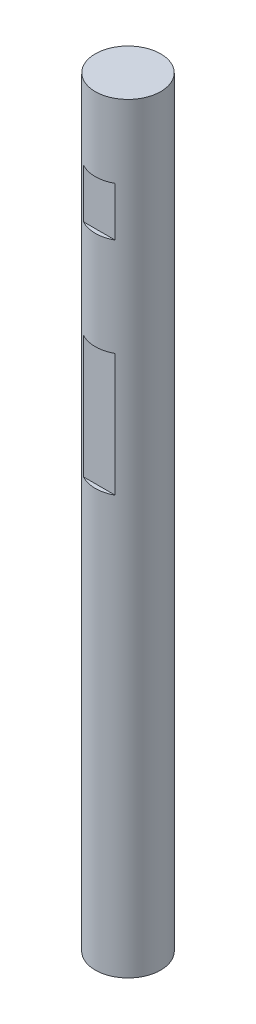
ISO-10303-21;
HEADER;
FILE_DESCRIPTION(('STEP AP214'),'2;1');
FILE_NAME('part.step','',(''),(''),'','','');
FILE_SCHEMA(('AUTOMOTIVE_DESIGN { 1 0 10303 214 1 1 1 1 }'));
ENDSEC;
DATA;
#1=APPLICATION_CONTEXT('core data for automotive mechanical design processes');
#2=APPLICATION_PROTOCOL_DEFINITION('international standard','automotive_design',2000,#1);
#3=PRODUCT_CONTEXT('',#1,'mechanical');
#4=PRODUCT('Part','Part','',(#3));
#5=PRODUCT_RELATED_PRODUCT_CATEGORY('part','',(#4));
#6=PRODUCT_DEFINITION_FORMATION('','',#4);
#7=PRODUCT_DEFINITION_CONTEXT('part definition',#1,'design');
#8=PRODUCT_DEFINITION('design','',#6,#7);
#9=PRODUCT_DEFINITION_SHAPE('','',#8);
#10=(LENGTH_UNIT() NAMED_UNIT(*) SI_UNIT(.MILLI.,.METRE.));
#11=(NAMED_UNIT(*) PLANE_ANGLE_UNIT() SI_UNIT($,.RADIAN.));
#12=(NAMED_UNIT(*) SI_UNIT($,.STERADIAN.) SOLID_ANGLE_UNIT());
#13=UNCERTAINTY_MEASURE_WITH_UNIT(LENGTH_MEASURE(1.E-05),#10,'distance_accuracy_value','');
#14=(GEOMETRIC_REPRESENTATION_CONTEXT(3) GLOBAL_UNCERTAINTY_ASSIGNED_CONTEXT((#13)) GLOBAL_UNIT_ASSIGNED_CONTEXT((#10,
#11,#12)) REPRESENTATION_CONTEXT('',''));
#15=CARTESIAN_POINT('',(0.,0.,0.));
#16=DIRECTION('',(0.,0.,1.));
#17=DIRECTION('',(1.,0.,0.));
#18=AXIS2_PLACEMENT_3D('',#15,#16,#17);
#19=CARTESIAN_POINT('',(4.0043,93.0043,4.0043));
#20=DIRECTION('',(0.,1.,0.));
#21=DIRECTION('',(0.,0.,1.));
#22=AXIS2_PLACEMENT_3D('',#19,#20,#21);
#23=PLANE('',#22);
#24=CARTESIAN_POINT('',(4.0043,93.0043,4.0043));
#25=DIRECTION('',(0.,1.,0.));
#26=DIRECTION('',(0.,0.,1.));
#27=AXIS2_PLACEMENT_3D('',#24,#25,#26);
#28=CIRCLE('',#27,4.);
#29=CARTESIAN_POINT('',(4.0043,93.0043,8.0043));
#30=VERTEX_POINT('',#29);
#31=EDGE_CURVE('E79',#30,#30,#28,.F.);
#32=ORIENTED_EDGE('',*,*,#31,.F.);
#33=EDGE_LOOP('',(#32));
#34=FACE_BOUND('',#33,.T.);
#35=ADVANCED_FACE('F15',(#34),#23,.T.);
#36=CARTESIAN_POINT('',(-0.9957,84.0043,7.5043));
#37=DIRECTION('',(0.,1.,0.));
#38=DIRECTION('',(0.,0.,1.));
#39=AXIS2_PLACEMENT_3D('',#36,#37,#38);
#40=PLANE('',#39);
#41=CARTESIAN_POINT('',(4.0043,84.0043,4.0043));
#42=DIRECTION('',(0.,1.,0.));
#43=DIRECTION('',(0.,0.,1.));
#44=AXIS2_PLACEMENT_3D('',#41,#42,#43);
#45=CIRCLE('',#44,4.);
#46=CARTESIAN_POINT('',(2.06780832689618,84.0043,7.50429999999994));
#47=VERTEX_POINT('',#46);
#48=CARTESIAN_POINT('',(5.94079167310382,84.0043,7.50429999999994));
#49=VERTEX_POINT('',#48);
#50=EDGE_CURVE('E83',#47,#49,#45,.T.);
#51=ORIENTED_EDGE('',*,*,#50,.F.);
#52=DIRECTION('',(1.,0.,0.));
#53=VECTOR('',#52,1.);
#54=CARTESIAN_POINT('',(-0.9957,84.0043,7.5043));
#55=LINE('',#54,#53);
#56=EDGE_CURVE('E76',#49,#47,#55,.F.);
#57=ORIENTED_EDGE('',*,*,#56,.F.);
#58=EDGE_LOOP('',(#51,#57));
#59=FACE_BOUND('',#58,.T.);
#60=ADVANCED_FACE('F160',(#59),#40,.F.);
#61=CARTESIAN_POINT('',(-0.9957,78.0043,7.5043));
#62=DIRECTION('',(0.,0.,1.));
#63=DIRECTION('',(1.,0.,0.));
#64=AXIS2_PLACEMENT_3D('',#61,#62,#63);
#65=PLANE('',#64);
#66=DIRECTION('',(1.,0.,0.));
#67=VECTOR('',#66,1.);
#68=CARTESIAN_POINT('',(-0.9957,78.0043,7.5043));
#69=LINE('',#68,#67);
#70=CARTESIAN_POINT('',(5.94079167310382,78.0043,7.50429999999994));
#71=VERTEX_POINT('',#70);
#72=CARTESIAN_POINT('',(2.06780832689618,78.0043,7.50429999999994));
#73=VERTEX_POINT('',#72);
#74=EDGE_CURVE('E52',#71,#73,#69,.F.);
#75=ORIENTED_EDGE('',*,*,#74,.F.);
#76=DIRECTION('',(0.,1.,0.));
#77=VECTOR('',#76,1.);
#78=CARTESIAN_POINT('',(5.94079167310393,0.004300000000001,7.50429999999988));
#79=LINE('',#78,#77);
#80=EDGE_CURVE('E73',#49,#71,#79,.F.);
#81=ORIENTED_EDGE('',*,*,#80,.F.);
#82=ORIENTED_EDGE('',*,*,#56,.T.);
#83=DIRECTION('',(0.,1.,0.));
#84=VECTOR('',#83,1.);
#85=CARTESIAN_POINT('',(2.06780832689607,0.004300000000001,7.50429999999988));
#86=LINE('',#85,#84);
#87=EDGE_CURVE('E81',#73,#47,#86,.T.);
#88=ORIENTED_EDGE('',*,*,#87,.F.);
#89=EDGE_LOOP('',(#75,#81,#82,#88));
#90=FACE_BOUND('',#89,.T.);
#91=ADVANCED_FACE('F102',(#90),#65,.T.);
#92=CARTESIAN_POINT('',(-0.9957,78.0043,7.5043));
#93=DIRECTION('',(0.,1.,0.));
#94=DIRECTION('',(0.,0.,1.));
#95=AXIS2_PLACEMENT_3D('',#92,#93,#94);
#96=PLANE('',#95);
#97=CARTESIAN_POINT('',(4.0043,78.0043,4.0043));
#98=DIRECTION('',(0.,1.,0.));
#99=DIRECTION('',(0.,0.,1.));
#100=AXIS2_PLACEMENT_3D('',#97,#98,#99);
#101=CIRCLE('',#100,4.);
#102=EDGE_CURVE('E84',#71,#73,#101,.F.);
#103=ORIENTED_EDGE('',*,*,#102,.F.);
#104=ORIENTED_EDGE('',*,*,#74,.T.);
#105=EDGE_LOOP('',(#103,#104));
#106=FACE_BOUND('',#105,.T.);
#107=ADVANCED_FACE('F93',(#106),#96,.T.);
#108=CARTESIAN_POINT('',(-0.9957,66.0043,7.5043));
#109=DIRECTION('',(0.,1.,0.));
#110=DIRECTION('',(0.,0.,1.));
#111=AXIS2_PLACEMENT_3D('',#108,#109,#110);
#112=PLANE('',#111);
#113=CARTESIAN_POINT('',(4.0043,66.0043,4.0043));
#114=DIRECTION('',(0.,1.,0.));
#115=DIRECTION('',(0.,0.,1.));
#116=AXIS2_PLACEMENT_3D('',#113,#114,#115);
#117=CIRCLE('',#116,4.);
#118=CARTESIAN_POINT('',(2.06780832689618,66.0043,7.50429999999994));
#119=VERTEX_POINT('',#118);
#120=CARTESIAN_POINT('',(5.94079167310382,66.0043,7.50429999999994));
#121=VERTEX_POINT('',#120);
#122=EDGE_CURVE('E18',#119,#121,#117,.T.);
#123=ORIENTED_EDGE('',*,*,#122,.F.);
#124=DIRECTION('',(1.,0.,0.));
#125=VECTOR('',#124,1.);
#126=CARTESIAN_POINT('',(-0.9957,66.0043,7.5043));
#127=LINE('',#126,#125);
#128=EDGE_CURVE('E56',#121,#119,#127,.F.);
#129=ORIENTED_EDGE('',*,*,#128,.F.);
#130=EDGE_LOOP('',(#123,#129));
#131=FACE_BOUND('',#130,.T.);
#132=ADVANCED_FACE('F91',(#131),#112,.F.);
#133=CARTESIAN_POINT('',(-0.9957,51.0043,7.5043));
#134=DIRECTION('',(0.,0.,1.));
#135=DIRECTION('',(1.,0.,0.));
#136=AXIS2_PLACEMENT_3D('',#133,#134,#135);
#137=PLANE('',#136);
#138=DIRECTION('',(1.,0.,0.));
#139=VECTOR('',#138,1.);
#140=CARTESIAN_POINT('',(-0.9957,51.0043,7.5043));
#141=LINE('',#140,#139);
#142=CARTESIAN_POINT('',(5.94079167310382,51.0043,7.50429999999994));
#143=VERTEX_POINT('',#142);
#144=CARTESIAN_POINT('',(2.06780832689618,51.0043,7.50429999999994));
#145=VERTEX_POINT('',#144);
#146=EDGE_CURVE('E33',#143,#145,#141,.F.);
#147=ORIENTED_EDGE('',*,*,#146,.F.);
#148=DIRECTION('',(0.,1.,0.));
#149=VECTOR('',#148,1.);
#150=CARTESIAN_POINT('',(5.94079167310393,0.004300000000001,7.50429999999988));
#151=LINE('',#150,#149);
#152=EDGE_CURVE('E64',#121,#143,#151,.F.);
#153=ORIENTED_EDGE('',*,*,#152,.F.);
#154=ORIENTED_EDGE('',*,*,#128,.T.);
#155=DIRECTION('',(0.,1.,0.));
#156=VECTOR('',#155,1.);
#157=CARTESIAN_POINT('',(2.06780832689607,0.004300000000001,7.50429999999988));
#158=LINE('',#157,#156);
#159=EDGE_CURVE('E63',#145,#119,#158,.T.);
#160=ORIENTED_EDGE('',*,*,#159,.F.);
#161=EDGE_LOOP('',(#147,#153,#154,#160));
#162=FACE_BOUND('',#161,.T.);
#163=ADVANCED_FACE('F67',(#162),#137,.T.);
#164=CARTESIAN_POINT('',(4.0043,0.004300000000001,4.0043));
#165=DIRECTION('',(0.,1.,0.));
#166=DIRECTION('',(0.,0.,1.));
#167=AXIS2_PLACEMENT_3D('',#164,#165,#166);
#168=PLANE('',#167);
#169=CARTESIAN_POINT('',(4.0043,0.004300000000001,4.0043));
#170=DIRECTION('',(0.,1.,0.));
#171=DIRECTION('',(0.,0.,1.));
#172=AXIS2_PLACEMENT_3D('',#169,#170,#171);
#173=CIRCLE('',#172,4.);
#174=CARTESIAN_POINT('',(4.0043,0.004300000000001,8.0043));
#175=VERTEX_POINT('',#174);
#176=EDGE_CURVE('E9',#175,#175,#173,.T.);
#177=ORIENTED_EDGE('',*,*,#176,.F.);
#178=EDGE_LOOP('',(#177));
#179=FACE_BOUND('',#178,.T.);
#180=ADVANCED_FACE('F100',(#179),#168,.F.);
#181=CARTESIAN_POINT('',(-0.9957,51.0043,7.5043));
#182=DIRECTION('',(0.,1.,0.));
#183=DIRECTION('',(0.,0.,1.));
#184=AXIS2_PLACEMENT_3D('',#181,#182,#183);
#185=PLANE('',#184);
#186=ORIENTED_EDGE('',*,*,#146,.T.);
#187=CARTESIAN_POINT('',(4.0043,51.0043,4.0043));
#188=DIRECTION('',(0.,1.,0.));
#189=DIRECTION('',(0.,0.,1.));
#190=AXIS2_PLACEMENT_3D('',#187,#188,#189);
#191=CIRCLE('',#190,4.);
#192=EDGE_CURVE('E24',#143,#145,#191,.F.);
#193=ORIENTED_EDGE('',*,*,#192,.F.);
#194=EDGE_LOOP('',(#186,#193));
#195=FACE_BOUND('',#194,.T.);
#196=ADVANCED_FACE('F69',(#195),#185,.T.);
#197=CARTESIAN_POINT('',(4.0043,0.004300000000001,4.0043));
#198=DIRECTION('',(0.,1.,0.));
#199=DIRECTION('',(0.,0.,1.));
#200=AXIS2_PLACEMENT_3D('',#197,#198,#199);
#201=CYLINDRICAL_SURFACE('',#200,4.);
#202=ORIENTED_EDGE('',*,*,#80,.T.);
#203=ORIENTED_EDGE('',*,*,#102,.T.);
#204=ORIENTED_EDGE('',*,*,#87,.T.);
#205=ORIENTED_EDGE('',*,*,#50,.T.);
#206=EDGE_LOOP('',(#202,#203,#204,#205));
#207=FACE_BOUND('',#206,.T.);
#208=ORIENTED_EDGE('',*,*,#31,.T.);
#209=EDGE_LOOP('',(#208));
#210=FACE_BOUND('',#209,.T.);
#211=ORIENTED_EDGE('',*,*,#176,.T.);
#212=EDGE_LOOP('',(#211));
#213=FACE_BOUND('',#212,.T.);
#214=ORIENTED_EDGE('',*,*,#192,.T.);
#215=ORIENTED_EDGE('',*,*,#159,.T.);
#216=ORIENTED_EDGE('',*,*,#122,.T.);
#217=ORIENTED_EDGE('',*,*,#152,.T.);
#218=EDGE_LOOP('',(#214,#215,#216,#217));
#219=FACE_BOUND('',#218,.T.);
#220=ADVANCED_FACE('F62',(#207,#210,#213,#219),#201,.T.);
#221=CLOSED_SHELL('',(#35,#60,#91,#107,#132,#163,#180,#196,#220));
#222=MANIFOLD_SOLID_BREP('B1',#221);
#223=ADVANCED_BREP_SHAPE_REPRESENTATION('',(#18,#222),#14);
#224=SHAPE_DEFINITION_REPRESENTATION(#9,#223);
ENDSEC;
END-ISO-10303-21;
